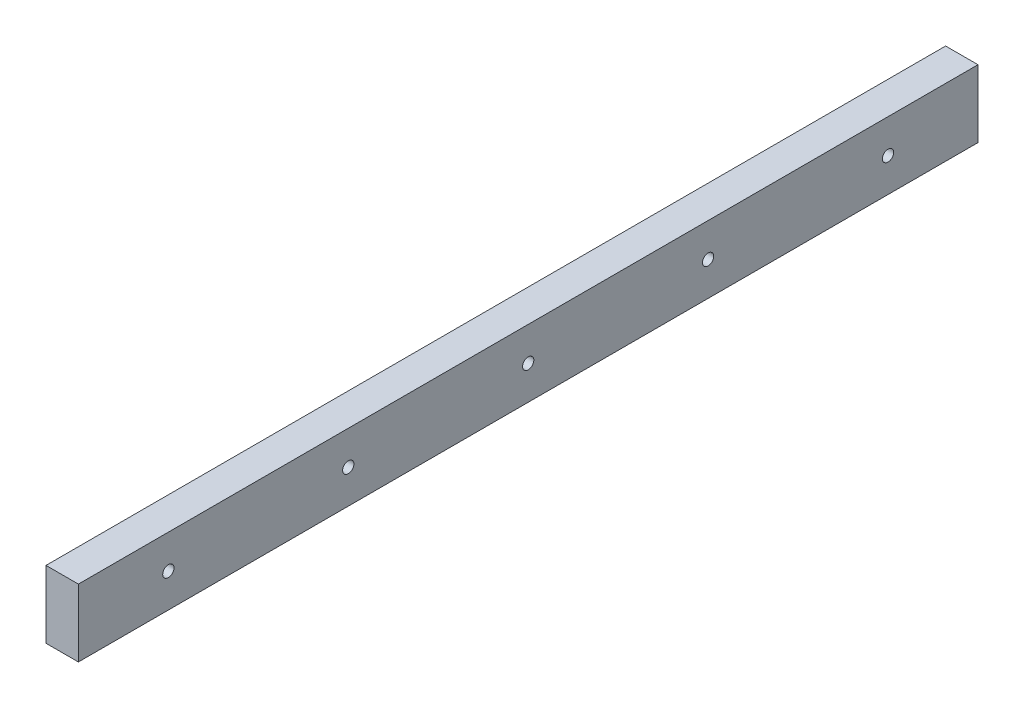
ISO-10303-21;
HEADER;
FILE_DESCRIPTION(('STEP AP214'),'2;1');
FILE_NAME('part.step','',(''),(''),'','','');
FILE_SCHEMA(('AUTOMOTIVE_DESIGN { 1 0 10303 214 1 1 1 1 }'));
ENDSEC;
DATA;
#1=APPLICATION_CONTEXT('core data for automotive mechanical design processes');
#2=APPLICATION_PROTOCOL_DEFINITION('international standard','automotive_design',2000,#1);
#3=PRODUCT_CONTEXT('',#1,'mechanical');
#4=PRODUCT('Part','Part','',(#3));
#5=PRODUCT_RELATED_PRODUCT_CATEGORY('part','',(#4));
#6=PRODUCT_DEFINITION_FORMATION('','',#4);
#7=PRODUCT_DEFINITION_CONTEXT('part definition',#1,'design');
#8=PRODUCT_DEFINITION('design','',#6,#7);
#9=PRODUCT_DEFINITION_SHAPE('','',#8);
#10=(LENGTH_UNIT() NAMED_UNIT(*) SI_UNIT(.MILLI.,.METRE.));
#11=(NAMED_UNIT(*) PLANE_ANGLE_UNIT() SI_UNIT($,.RADIAN.));
#12=(NAMED_UNIT(*) SI_UNIT($,.STERADIAN.) SOLID_ANGLE_UNIT());
#13=UNCERTAINTY_MEASURE_WITH_UNIT(LENGTH_MEASURE(1.E-05),#10,'distance_accuracy_value','');
#14=(GEOMETRIC_REPRESENTATION_CONTEXT(3) GLOBAL_UNCERTAINTY_ASSIGNED_CONTEXT((#13)) GLOBAL_UNIT_ASSIGNED_CONTEXT((#10,
#11,#12)) REPRESENTATION_CONTEXT('',''));
#15=CARTESIAN_POINT('',(0.,0.,0.));
#16=DIRECTION('',(0.,0.,1.));
#17=DIRECTION('',(1.,0.,0.));
#18=AXIS2_PLACEMENT_3D('',#15,#16,#17);
#19=CARTESIAN_POINT('',(18.288,-19.05,254.));
#20=DIRECTION('',(0.,0.,-1.));
#21=DIRECTION('',(-1.,0.,0.));
#22=AXIS2_PLACEMENT_3D('',#19,#20,#21);
#23=PLANE('',#22);
#24=DIRECTION('',(0.,-1.,0.));
#25=VECTOR('',#24,1.);
#26=CARTESIAN_POINT('',(0.,-19.05,254.));
#27=LINE('',#26,#25);
#28=CARTESIAN_POINT('',(0.,19.05,254.));
#29=VERTEX_POINT('',#28);
#30=CARTESIAN_POINT('',(0.,-19.05,254.));
#31=VERTEX_POINT('',#30);
#32=EDGE_CURVE('E95',#29,#31,#27,.T.);
#33=ORIENTED_EDGE('',*,*,#32,.T.);
#34=DIRECTION('',(-1.,0.,0.));
#35=VECTOR('',#34,1.);
#36=CARTESIAN_POINT('',(18.288,-19.05,254.));
#37=LINE('',#36,#35);
#38=CARTESIAN_POINT('',(18.288,-19.05,254.));
#39=VERTEX_POINT('',#38);
#40=EDGE_CURVE('E11',#39,#31,#37,.T.);
#41=ORIENTED_EDGE('',*,*,#40,.F.);
#42=DIRECTION('',(0.,-1.,0.));
#43=VECTOR('',#42,1.);
#44=CARTESIAN_POINT('',(18.288,-19.05,254.));
#45=LINE('',#44,#43);
#46=CARTESIAN_POINT('',(18.288,19.05,254.));
#47=VERTEX_POINT('',#46);
#48=EDGE_CURVE('E83',#47,#39,#45,.T.);
#49=ORIENTED_EDGE('',*,*,#48,.F.);
#50=DIRECTION('',(-1.,0.,0.));
#51=VECTOR('',#50,1.);
#52=CARTESIAN_POINT('',(18.288,19.05,254.));
#53=LINE('',#52,#51);
#54=EDGE_CURVE('E91',#47,#29,#53,.T.);
#55=ORIENTED_EDGE('',*,*,#54,.T.);
#56=EDGE_LOOP('',(#33,#41,#49,#55));
#57=FACE_BOUND('',#56,.T.);
#58=ADVANCED_FACE('F32',(#57),#23,.F.);
#59=CARTESIAN_POINT('',(18.288,-19.05,-254.));
#60=DIRECTION('',(0.,1.,0.));
#61=DIRECTION('',(0.,0.,1.));
#62=AXIS2_PLACEMENT_3D('',#59,#60,#61);
#63=PLANE('',#62);
#64=DIRECTION('',(0.,0.,-1.));
#65=VECTOR('',#64,1.);
#66=CARTESIAN_POINT('',(0.,-19.05,-254.));
#67=LINE('',#66,#65);
#68=CARTESIAN_POINT('',(0.,-19.05,-254.));
#69=VERTEX_POINT('',#68);
#70=EDGE_CURVE('E87',#31,#69,#67,.T.);
#71=ORIENTED_EDGE('',*,*,#70,.T.);
#72=DIRECTION('',(-1.,0.,0.));
#73=VECTOR('',#72,1.);
#74=CARTESIAN_POINT('',(18.288,-19.05,-254.));
#75=LINE('',#74,#73);
#76=CARTESIAN_POINT('',(18.288,-19.05,-254.));
#77=VERTEX_POINT('',#76);
#78=EDGE_CURVE('E40',#77,#69,#75,.T.);
#79=ORIENTED_EDGE('',*,*,#78,.F.);
#80=DIRECTION('',(0.,0.,-1.));
#81=VECTOR('',#80,1.);
#82=CARTESIAN_POINT('',(18.288,-19.05,-254.));
#83=LINE('',#82,#81);
#84=EDGE_CURVE('E78',#39,#77,#83,.T.);
#85=ORIENTED_EDGE('',*,*,#84,.F.);
#86=ORIENTED_EDGE('',*,*,#40,.T.);
#87=EDGE_LOOP('',(#71,#79,#85,#86));
#88=FACE_BOUND('',#87,.T.);
#89=ADVANCED_FACE('F86',(#88),#63,.F.);
#90=CARTESIAN_POINT('',(18.288,-19.05,-254.));
#91=DIRECTION('',(0.,0.,1.));
#92=DIRECTION('',(1.,0.,0.));
#93=AXIS2_PLACEMENT_3D('',#90,#91,#92);
#94=PLANE('',#93);
#95=DIRECTION('',(0.,1.,0.));
#96=VECTOR('',#95,1.);
#97=CARTESIAN_POINT('',(0.,-19.05,-254.));
#98=LINE('',#97,#96);
#99=CARTESIAN_POINT('',(0.,19.05,-254.));
#100=VERTEX_POINT('',#99);
#101=EDGE_CURVE('E65',#69,#100,#98,.T.);
#102=ORIENTED_EDGE('',*,*,#101,.T.);
#103=DIRECTION('',(-1.,0.,0.));
#104=VECTOR('',#103,1.);
#105=CARTESIAN_POINT('',(18.288,19.05,-254.));
#106=LINE('',#105,#104);
#107=CARTESIAN_POINT('',(18.288,19.05,-254.));
#108=VERTEX_POINT('',#107);
#109=EDGE_CURVE('E88',#108,#100,#106,.T.);
#110=ORIENTED_EDGE('',*,*,#109,.F.);
#111=DIRECTION('',(0.,1.,0.));
#112=VECTOR('',#111,1.);
#113=CARTESIAN_POINT('',(18.288,-19.05,-254.));
#114=LINE('',#113,#112);
#115=EDGE_CURVE('E81',#77,#108,#114,.T.);
#116=ORIENTED_EDGE('',*,*,#115,.F.);
#117=ORIENTED_EDGE('',*,*,#78,.T.);
#118=EDGE_LOOP('',(#102,#110,#116,#117));
#119=FACE_BOUND('',#118,.T.);
#120=ADVANCED_FACE('F89',(#119),#94,.F.);
#121=CARTESIAN_POINT('',(18.288,19.05,-254.));
#122=DIRECTION('',(0.,-1.,0.));
#123=DIRECTION('',(0.,0.,-1.));
#124=AXIS2_PLACEMENT_3D('',#121,#122,#123);
#125=PLANE('',#124);
#126=DIRECTION('',(0.,0.,1.));
#127=VECTOR('',#126,1.);
#128=CARTESIAN_POINT('',(0.,19.05,-254.));
#129=LINE('',#128,#127);
#130=EDGE_CURVE('E71',#100,#29,#129,.T.);
#131=ORIENTED_EDGE('',*,*,#130,.T.);
#132=ORIENTED_EDGE('',*,*,#54,.F.);
#133=DIRECTION('',(0.,0.,1.));
#134=VECTOR('',#133,1.);
#135=CARTESIAN_POINT('',(18.288,19.05,-254.));
#136=LINE('',#135,#134);
#137=EDGE_CURVE('E48',#108,#47,#136,.T.);
#138=ORIENTED_EDGE('',*,*,#137,.F.);
#139=ORIENTED_EDGE('',*,*,#109,.T.);
#140=EDGE_LOOP('',(#131,#132,#138,#139));
#141=FACE_BOUND('',#140,.T.);
#142=ADVANCED_FACE('F103',(#141),#125,.F.);
#143=CARTESIAN_POINT('',(18.288,0.,0.));
#144=DIRECTION('',(1.,0.,0.));
#145=DIRECTION('',(0.,0.,-1.));
#146=AXIS2_PLACEMENT_3D('',#143,#144,#145);
#147=PLANE('',#146);
#148=CARTESIAN_POINT('',(18.288,0.,-203.2));
#149=DIRECTION('',(1.,0.,0.));
#150=DIRECTION('',(0.,0.,-1.));
#151=AXIS2_PLACEMENT_3D('',#148,#149,#150);
#152=CIRCLE('',#151,3.175);
#153=CARTESIAN_POINT('',(18.288,0.,-206.375));
#154=VERTEX_POINT('',#153);
#155=EDGE_CURVE('E133',#154,#154,#152,.T.);
#156=ORIENTED_EDGE('',*,*,#155,.F.);
#157=EDGE_LOOP('',(#156));
#158=FACE_BOUND('',#157,.T.);
#159=CARTESIAN_POINT('',(18.288,-7.09469008052925E-13,-101.6));
#160=DIRECTION('',(1.,0.,0.));
#161=DIRECTION('',(0.,0.,-1.));
#162=AXIS2_PLACEMENT_3D('',#159,#160,#161);
#163=CIRCLE('',#162,3.175);
#164=CARTESIAN_POINT('',(18.288,-7.09469008052925E-13,-104.775));
#165=VERTEX_POINT('',#164);
#166=EDGE_CURVE('E127',#165,#165,#163,.T.);
#167=ORIENTED_EDGE('',*,*,#166,.F.);
#168=EDGE_LOOP('',(#167));
#169=FACE_BOUND('',#168,.T.);
#170=CARTESIAN_POINT('',(18.288,-1.41893801610585E-12,0.));
#171=DIRECTION('',(1.,0.,0.));
#172=DIRECTION('',(0.,0.,-1.));
#173=AXIS2_PLACEMENT_3D('',#170,#171,#172);
#174=CIRCLE('',#173,3.175);
#175=CARTESIAN_POINT('',(18.288,-1.41893801610585E-12,-3.17499999999994));
#176=VERTEX_POINT('',#175);
#177=EDGE_CURVE('E121',#176,#176,#174,.T.);
#178=ORIENTED_EDGE('',*,*,#177,.F.);
#179=EDGE_LOOP('',(#178));
#180=FACE_BOUND('',#179,.T.);
#181=CARTESIAN_POINT('',(18.288,-2.12840702415877E-12,101.6));
#182=DIRECTION('',(1.,0.,0.));
#183=DIRECTION('',(0.,0.,-1.));
#184=AXIS2_PLACEMENT_3D('',#181,#182,#183);
#185=CIRCLE('',#184,3.175);
#186=CARTESIAN_POINT('',(18.288,-2.12840702415877E-12,98.425));
#187=VERTEX_POINT('',#186);
#188=EDGE_CURVE('E115',#187,#187,#185,.T.);
#189=ORIENTED_EDGE('',*,*,#188,.F.);
#190=EDGE_LOOP('',(#189));
#191=FACE_BOUND('',#190,.T.);
#192=CARTESIAN_POINT('',(18.288,-2.8378760322117E-12,203.2));
#193=DIRECTION('',(1.,0.,0.));
#194=DIRECTION('',(0.,0.,-1.));
#195=AXIS2_PLACEMENT_3D('',#192,#193,#194);
#196=CIRCLE('',#195,3.175);
#197=CARTESIAN_POINT('',(18.288,-2.8378760322117E-12,200.025));
#198=VERTEX_POINT('',#197);
#199=EDGE_CURVE('E109',#198,#198,#196,.T.);
#200=ORIENTED_EDGE('',*,*,#199,.F.);
#201=EDGE_LOOP('',(#200));
#202=FACE_BOUND('',#201,.T.);
#203=ORIENTED_EDGE('',*,*,#48,.T.);
#204=ORIENTED_EDGE('',*,*,#84,.T.);
#205=ORIENTED_EDGE('',*,*,#115,.T.);
#206=ORIENTED_EDGE('',*,*,#137,.T.);
#207=EDGE_LOOP('',(#203,#204,#205,#206));
#208=FACE_BOUND('',#207,.T.);
#209=ADVANCED_FACE('F79',(#158,#169,#180,#191,#202,#208),#147,.T.);
#210=CARTESIAN_POINT('',(0.,0.,0.));
#211=DIRECTION('',(1.,0.,0.));
#212=DIRECTION('',(0.,0.,-1.));
#213=AXIS2_PLACEMENT_3D('',#210,#211,#212);
#214=PLANE('',#213);
#215=CARTESIAN_POINT('',(0.,0.,-203.2));
#216=DIRECTION('',(1.,0.,0.));
#217=DIRECTION('',(0.,0.,-1.));
#218=AXIS2_PLACEMENT_3D('',#215,#216,#217);
#219=CIRCLE('',#218,3.175);
#220=CARTESIAN_POINT('',(0.,0.,-206.375));
#221=VERTEX_POINT('',#220);
#222=EDGE_CURVE('E98',#221,#221,#219,.T.);
#223=ORIENTED_EDGE('',*,*,#222,.T.);
#224=EDGE_LOOP('',(#223));
#225=FACE_BOUND('',#224,.T.);
#226=CARTESIAN_POINT('',(0.,-7.09469008052925E-13,-101.6));
#227=DIRECTION('',(1.,0.,0.));
#228=DIRECTION('',(0.,0.,-1.));
#229=AXIS2_PLACEMENT_3D('',#226,#227,#228);
#230=CIRCLE('',#229,3.175);
#231=CARTESIAN_POINT('',(0.,-7.09469008052925E-13,-104.775));
#232=VERTEX_POINT('',#231);
#233=EDGE_CURVE('E130',#232,#232,#230,.T.);
#234=ORIENTED_EDGE('',*,*,#233,.T.);
#235=EDGE_LOOP('',(#234));
#236=FACE_BOUND('',#235,.T.);
#237=CARTESIAN_POINT('',(0.,-1.41893801610585E-12,0.));
#238=DIRECTION('',(1.,0.,0.));
#239=DIRECTION('',(0.,0.,-1.));
#240=AXIS2_PLACEMENT_3D('',#237,#238,#239);
#241=CIRCLE('',#240,3.175);
#242=CARTESIAN_POINT('',(0.,-1.41893801610585E-12,-3.17499999999994));
#243=VERTEX_POINT('',#242);
#244=EDGE_CURVE('E124',#243,#243,#241,.T.);
#245=ORIENTED_EDGE('',*,*,#244,.T.);
#246=EDGE_LOOP('',(#245));
#247=FACE_BOUND('',#246,.T.);
#248=CARTESIAN_POINT('',(0.,-2.12840702415877E-12,101.6));
#249=DIRECTION('',(1.,0.,0.));
#250=DIRECTION('',(0.,0.,-1.));
#251=AXIS2_PLACEMENT_3D('',#248,#249,#250);
#252=CIRCLE('',#251,3.175);
#253=CARTESIAN_POINT('',(0.,-2.12840702415877E-12,98.425));
#254=VERTEX_POINT('',#253);
#255=EDGE_CURVE('E118',#254,#254,#252,.T.);
#256=ORIENTED_EDGE('',*,*,#255,.T.);
#257=EDGE_LOOP('',(#256));
#258=FACE_BOUND('',#257,.T.);
#259=CARTESIAN_POINT('',(0.,-2.8378760322117E-12,203.2));
#260=DIRECTION('',(1.,0.,0.));
#261=DIRECTION('',(0.,0.,-1.));
#262=AXIS2_PLACEMENT_3D('',#259,#260,#261);
#263=CIRCLE('',#262,3.175);
#264=CARTESIAN_POINT('',(0.,-2.8378760322117E-12,200.025));
#265=VERTEX_POINT('',#264);
#266=EDGE_CURVE('E112',#265,#265,#263,.T.);
#267=ORIENTED_EDGE('',*,*,#266,.T.);
#268=EDGE_LOOP('',(#267));
#269=FACE_BOUND('',#268,.T.);
#270=ORIENTED_EDGE('',*,*,#32,.F.);
#271=ORIENTED_EDGE('',*,*,#130,.F.);
#272=ORIENTED_EDGE('',*,*,#101,.F.);
#273=ORIENTED_EDGE('',*,*,#70,.F.);
#274=EDGE_LOOP('',(#270,#271,#272,#273));
#275=FACE_BOUND('',#274,.T.);
#276=ADVANCED_FACE('F106',(#225,#236,#247,#258,#269,#275),#214,.F.);
#277=CARTESIAN_POINT('',(0.,-2.8378760322117E-12,203.2));
#278=DIRECTION('',(1.,0.,0.));
#279=DIRECTION('',(0.,0.,-1.));
#280=AXIS2_PLACEMENT_3D('',#277,#278,#279);
#281=CYLINDRICAL_SURFACE('',#280,3.175);
#282=ORIENTED_EDGE('',*,*,#266,.F.);
#283=EDGE_LOOP('',(#282));
#284=FACE_BOUND('',#283,.T.);
#285=ORIENTED_EDGE('',*,*,#199,.T.);
#286=EDGE_LOOP('',(#285));
#287=FACE_BOUND('',#286,.T.);
#288=ADVANCED_FACE('F159',(#284,#287),#281,.F.);
#289=CARTESIAN_POINT('',(0.,-2.12840702415877E-12,101.6));
#290=DIRECTION('',(1.,0.,0.));
#291=DIRECTION('',(0.,0.,-1.));
#292=AXIS2_PLACEMENT_3D('',#289,#290,#291);
#293=CYLINDRICAL_SURFACE('',#292,3.175);
#294=ORIENTED_EDGE('',*,*,#255,.F.);
#295=EDGE_LOOP('',(#294));
#296=FACE_BOUND('',#295,.T.);
#297=ORIENTED_EDGE('',*,*,#188,.T.);
#298=EDGE_LOOP('',(#297));
#299=FACE_BOUND('',#298,.T.);
#300=ADVANCED_FACE('F161',(#296,#299),#293,.F.);
#301=CARTESIAN_POINT('',(0.,-1.41893801610585E-12,0.));
#302=DIRECTION('',(1.,0.,0.));
#303=DIRECTION('',(0.,0.,-1.));
#304=AXIS2_PLACEMENT_3D('',#301,#302,#303);
#305=CYLINDRICAL_SURFACE('',#304,3.175);
#306=ORIENTED_EDGE('',*,*,#244,.F.);
#307=EDGE_LOOP('',(#306));
#308=FACE_BOUND('',#307,.T.);
#309=ORIENTED_EDGE('',*,*,#177,.T.);
#310=EDGE_LOOP('',(#309));
#311=FACE_BOUND('',#310,.T.);
#312=ADVANCED_FACE('F168',(#308,#311),#305,.F.);
#313=CARTESIAN_POINT('',(0.,-7.09469008052925E-13,-101.6));
#314=DIRECTION('',(1.,0.,0.));
#315=DIRECTION('',(0.,0.,-1.));
#316=AXIS2_PLACEMENT_3D('',#313,#314,#315);
#317=CYLINDRICAL_SURFACE('',#316,3.175);
#318=ORIENTED_EDGE('',*,*,#233,.F.);
#319=EDGE_LOOP('',(#318));
#320=FACE_BOUND('',#319,.T.);
#321=ORIENTED_EDGE('',*,*,#166,.T.);
#322=EDGE_LOOP('',(#321));
#323=FACE_BOUND('',#322,.T.);
#324=ADVANCED_FACE('F144',(#320,#323),#317,.F.);
#325=CARTESIAN_POINT('',(0.,0.,-203.2));
#326=DIRECTION('',(1.,0.,0.));
#327=DIRECTION('',(0.,0.,-1.));
#328=AXIS2_PLACEMENT_3D('',#325,#326,#327);
#329=CYLINDRICAL_SURFACE('',#328,3.175);
#330=ORIENTED_EDGE('',*,*,#222,.F.);
#331=EDGE_LOOP('',(#330));
#332=FACE_BOUND('',#331,.T.);
#333=ORIENTED_EDGE('',*,*,#155,.T.);
#334=EDGE_LOOP('',(#333));
#335=FACE_BOUND('',#334,.T.);
#336=ADVANCED_FACE('F141',(#332,#335),#329,.F.);
#337=CLOSED_SHELL('',(#58,#89,#120,#142,#209,#276,#288,#300,#312,#324,#336));
#338=MANIFOLD_SOLID_BREP('B2',#337);
#339=ADVANCED_BREP_SHAPE_REPRESENTATION('',(#18,#338),#14);
#340=SHAPE_DEFINITION_REPRESENTATION(#9,#339);
ENDSEC;
END-ISO-10303-21;
